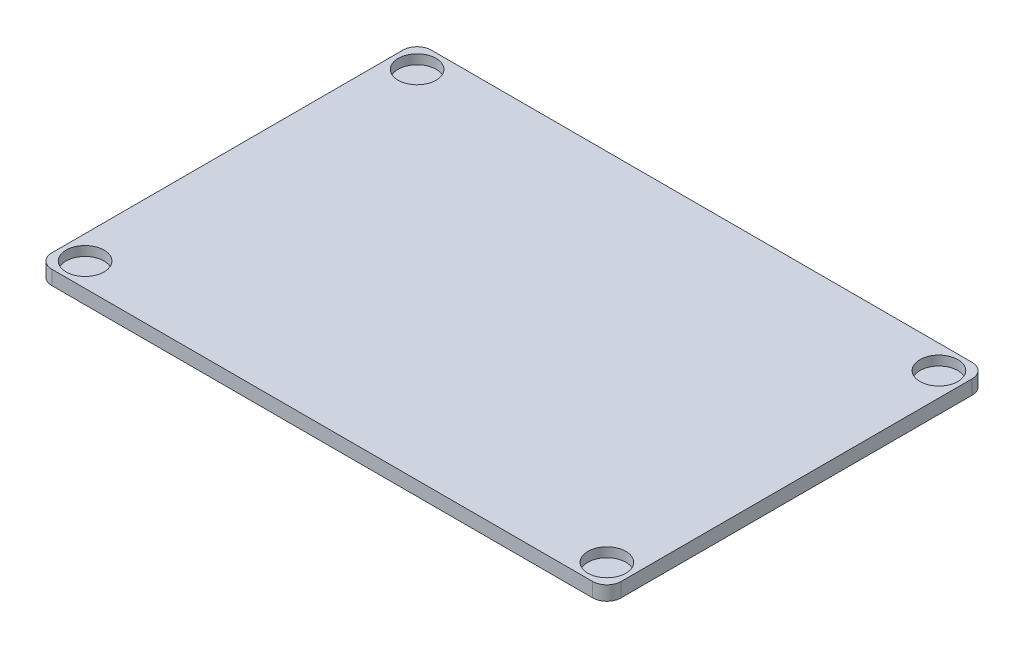
ISO-10303-21;
HEADER;
FILE_DESCRIPTION(('STEP AP214'),'2;1');
FILE_NAME('part.step','',(''),(''),'','','');
FILE_SCHEMA(('AUTOMOTIVE_DESIGN { 1 0 10303 214 1 1 1 1 }'));
ENDSEC;
DATA;
#1=APPLICATION_CONTEXT('core data for automotive mechanical design processes');
#2=APPLICATION_PROTOCOL_DEFINITION('international standard','automotive_design',2000,#1);
#3=PRODUCT_CONTEXT('',#1,'mechanical');
#4=PRODUCT('Part','Part','',(#3));
#5=PRODUCT_RELATED_PRODUCT_CATEGORY('part','',(#4));
#6=PRODUCT_DEFINITION_FORMATION('','',#4);
#7=PRODUCT_DEFINITION_CONTEXT('part definition',#1,'design');
#8=PRODUCT_DEFINITION('design','',#6,#7);
#9=PRODUCT_DEFINITION_SHAPE('','',#8);
#10=(LENGTH_UNIT() NAMED_UNIT(*) SI_UNIT(.MILLI.,.METRE.));
#11=(NAMED_UNIT(*) PLANE_ANGLE_UNIT() SI_UNIT($,.RADIAN.));
#12=(NAMED_UNIT(*) SI_UNIT($,.STERADIAN.) SOLID_ANGLE_UNIT());
#13=UNCERTAINTY_MEASURE_WITH_UNIT(LENGTH_MEASURE(1.E-05),#10,'distance_accuracy_value','');
#14=(GEOMETRIC_REPRESENTATION_CONTEXT(3) GLOBAL_UNCERTAINTY_ASSIGNED_CONTEXT((#13)) GLOBAL_UNIT_ASSIGNED_CONTEXT((#10,
#11,#12)) REPRESENTATION_CONTEXT('',''));
#15=CARTESIAN_POINT('',(0.,0.,0.));
#16=DIRECTION('',(0.,0.,1.));
#17=DIRECTION('',(1.,0.,0.));
#18=AXIS2_PLACEMENT_3D('',#15,#16,#17);
#19=CARTESIAN_POINT('',(0.,3.,0.));
#20=DIRECTION('',(1.,0.,0.));
#21=DIRECTION('',(0.,0.,-1.));
#22=AXIS2_PLACEMENT_3D('',#19,#20,#21);
#23=PLANE('',#22);
#24=DIRECTION('',(0.,0.,1.));
#25=VECTOR('',#24,1.);
#26=CARTESIAN_POINT('',(0.,0.,0.));
#27=LINE('',#26,#25);
#28=CARTESIAN_POINT('',(0.,0.,-77.));
#29=VERTEX_POINT('',#28);
#30=CARTESIAN_POINT('',(0.,0.,-3.));
#31=VERTEX_POINT('',#30);
#32=EDGE_CURVE('E132',#29,#31,#27,.T.);
#33=ORIENTED_EDGE('',*,*,#32,.T.);
#34=DIRECTION('',(0.,-1.,0.));
#35=VECTOR('',#34,1.);
#36=CARTESIAN_POINT('',(0.,3.,-3.));
#37=LINE('',#36,#35);
#38=CARTESIAN_POINT('',(0.,3.,-3.));
#39=VERTEX_POINT('',#38);
#40=EDGE_CURVE('E110',#31,#39,#37,.F.);
#41=ORIENTED_EDGE('',*,*,#40,.T.);
#42=DIRECTION('',(0.,0.,1.));
#43=VECTOR('',#42,1.);
#44=CARTESIAN_POINT('',(0.,3.,0.));
#45=LINE('',#44,#43);
#46=CARTESIAN_POINT('',(0.,3.,-77.));
#47=VERTEX_POINT('',#46);
#48=EDGE_CURVE('E142',#47,#39,#45,.T.);
#49=ORIENTED_EDGE('',*,*,#48,.F.);
#50=DIRECTION('',(0.,-1.,0.));
#51=VECTOR('',#50,1.);
#52=CARTESIAN_POINT('',(0.,3.,-77.));
#53=LINE('',#52,#51);
#54=EDGE_CURVE('E115',#47,#29,#53,.T.);
#55=ORIENTED_EDGE('',*,*,#54,.T.);
#56=EDGE_LOOP('',(#33,#41,#49,#55));
#57=FACE_BOUND('',#56,.T.);
#58=ADVANCED_FACE('F39',(#57),#23,.F.);
#59=CARTESIAN_POINT('',(0.,3.,0.));
#60=DIRECTION('',(0.,0.,-1.));
#61=DIRECTION('',(-1.,0.,0.));
#62=AXIS2_PLACEMENT_3D('',#59,#60,#61);
#63=PLANE('',#62);
#64=DIRECTION('',(1.,0.,0.));
#65=VECTOR('',#64,1.);
#66=CARTESIAN_POINT('',(0.,3.,0.));
#67=LINE('',#66,#65);
#68=CARTESIAN_POINT('',(3.,3.,0.));
#69=VERTEX_POINT('',#68);
#70=CARTESIAN_POINT('',(117.,3.,0.));
#71=VERTEX_POINT('',#70);
#72=EDGE_CURVE('E125',#69,#71,#67,.T.);
#73=ORIENTED_EDGE('',*,*,#72,.F.);
#74=DIRECTION('',(0.,-1.,0.));
#75=VECTOR('',#74,1.);
#76=CARTESIAN_POINT('',(3.,3.,0.));
#77=LINE('',#76,#75);
#78=CARTESIAN_POINT('',(3.,0.,0.));
#79=VERTEX_POINT('',#78);
#80=EDGE_CURVE('E109',#69,#79,#77,.T.);
#81=ORIENTED_EDGE('',*,*,#80,.T.);
#82=DIRECTION('',(1.,0.,0.));
#83=VECTOR('',#82,1.);
#84=CARTESIAN_POINT('',(0.,0.,0.));
#85=LINE('',#84,#83);
#86=CARTESIAN_POINT('',(117.,0.,0.));
#87=VERTEX_POINT('',#86);
#88=EDGE_CURVE('E122',#79,#87,#85,.T.);
#89=ORIENTED_EDGE('',*,*,#88,.T.);
#90=DIRECTION('',(0.,-1.,0.));
#91=VECTOR('',#90,1.);
#92=CARTESIAN_POINT('',(117.,3.,0.));
#93=LINE('',#92,#91);
#94=EDGE_CURVE('E127',#87,#71,#93,.F.);
#95=ORIENTED_EDGE('',*,*,#94,.T.);
#96=EDGE_LOOP('',(#73,#81,#89,#95));
#97=FACE_BOUND('',#96,.T.);
#98=ADVANCED_FACE('F121',(#97),#63,.F.);
#99=CARTESIAN_POINT('',(120.,3.,0.));
#100=DIRECTION('',(-1.,0.,0.));
#101=DIRECTION('',(0.,0.,1.));
#102=AXIS2_PLACEMENT_3D('',#99,#100,#101);
#103=PLANE('',#102);
#104=DIRECTION('',(0.,0.,-1.));
#105=VECTOR('',#104,1.);
#106=CARTESIAN_POINT('',(120.,0.,0.));
#107=LINE('',#106,#105);
#108=CARTESIAN_POINT('',(120.,0.,-3.));
#109=VERTEX_POINT('',#108);
#110=CARTESIAN_POINT('',(120.,0.,-77.));
#111=VERTEX_POINT('',#110);
#112=EDGE_CURVE('E131',#109,#111,#107,.T.);
#113=ORIENTED_EDGE('',*,*,#112,.T.);
#114=DIRECTION('',(0.,-1.,0.));
#115=VECTOR('',#114,1.);
#116=CARTESIAN_POINT('',(120.,3.,-77.));
#117=LINE('',#116,#115);
#118=CARTESIAN_POINT('',(120.,3.,-77.));
#119=VERTEX_POINT('',#118);
#120=EDGE_CURVE('E11',#111,#119,#117,.F.);
#121=ORIENTED_EDGE('',*,*,#120,.T.);
#122=DIRECTION('',(0.,0.,-1.));
#123=VECTOR('',#122,1.);
#124=CARTESIAN_POINT('',(120.,3.,0.));
#125=LINE('',#124,#123);
#126=CARTESIAN_POINT('',(120.,3.,-3.));
#127=VERTEX_POINT('',#126);
#128=EDGE_CURVE('E168',#127,#119,#125,.T.);
#129=ORIENTED_EDGE('',*,*,#128,.F.);
#130=DIRECTION('',(0.,-1.,0.));
#131=VECTOR('',#130,1.);
#132=CARTESIAN_POINT('',(120.,3.,-3.));
#133=LINE('',#132,#131);
#134=EDGE_CURVE('E47',#127,#109,#133,.T.);
#135=ORIENTED_EDGE('',*,*,#134,.T.);
#136=EDGE_LOOP('',(#113,#121,#129,#135));
#137=FACE_BOUND('',#136,.T.);
#138=ADVANCED_FACE('F166',(#137),#103,.F.);
#139=CARTESIAN_POINT('',(0.,3.,-80.));
#140=DIRECTION('',(0.,0.,1.));
#141=DIRECTION('',(1.,0.,0.));
#142=AXIS2_PLACEMENT_3D('',#139,#140,#141);
#143=PLANE('',#142);
#144=DIRECTION('',(-1.,0.,0.));
#145=VECTOR('',#144,1.);
#146=CARTESIAN_POINT('',(0.,0.,-80.));
#147=LINE('',#146,#145);
#148=CARTESIAN_POINT('',(117.,0.,-80.));
#149=VERTEX_POINT('',#148);
#150=CARTESIAN_POINT('',(3.,0.,-80.));
#151=VERTEX_POINT('',#150);
#152=EDGE_CURVE('E135',#149,#151,#147,.T.);
#153=ORIENTED_EDGE('',*,*,#152,.T.);
#154=DIRECTION('',(0.,-1.,0.));
#155=VECTOR('',#154,1.);
#156=CARTESIAN_POINT('',(3.,3.,-80.));
#157=LINE('',#156,#155);
#158=CARTESIAN_POINT('',(3.,3.,-80.));
#159=VERTEX_POINT('',#158);
#160=EDGE_CURVE('E54',#151,#159,#157,.F.);
#161=ORIENTED_EDGE('',*,*,#160,.T.);
#162=DIRECTION('',(-1.,0.,0.));
#163=VECTOR('',#162,1.);
#164=CARTESIAN_POINT('',(0.,3.,-80.));
#165=LINE('',#164,#163);
#166=CARTESIAN_POINT('',(117.,3.,-80.));
#167=VERTEX_POINT('',#166);
#168=EDGE_CURVE('E143',#167,#159,#165,.T.);
#169=ORIENTED_EDGE('',*,*,#168,.F.);
#170=DIRECTION('',(0.,-1.,0.));
#171=VECTOR('',#170,1.);
#172=CARTESIAN_POINT('',(117.,3.,-80.));
#173=LINE('',#172,#171);
#174=EDGE_CURVE('E159',#167,#149,#173,.T.);
#175=ORIENTED_EDGE('',*,*,#174,.T.);
#176=EDGE_LOOP('',(#153,#161,#169,#175));
#177=FACE_BOUND('',#176,.T.);
#178=ADVANCED_FACE('F175',(#177),#143,.F.);
#179=CARTESIAN_POINT('',(0.,3.,0.));
#180=DIRECTION('',(0.,-1.,0.));
#181=DIRECTION('',(0.,0.,-1.));
#182=AXIS2_PLACEMENT_3D('',#179,#180,#181);
#183=PLANE('',#182);
#184=CARTESIAN_POINT('',(115.,3.,-5.));
#185=DIRECTION('',(0.,1.,0.));
#186=DIRECTION('',(0.,0.,-1.));
#187=AXIS2_PLACEMENT_3D('',#184,#185,#186);
#188=CIRCLE('',#187,4.);
#189=CARTESIAN_POINT('',(115.,3.,-9.00000000000001));
#190=VERTEX_POINT('',#189);
#191=EDGE_CURVE('E200',#190,#190,#188,.T.);
#192=ORIENTED_EDGE('',*,*,#191,.F.);
#193=EDGE_LOOP('',(#192));
#194=FACE_BOUND('',#193,.T.);
#195=CARTESIAN_POINT('',(115.,3.,-75.));
#196=DIRECTION('',(0.,-1.,0.));
#197=DIRECTION('',(0.,0.,1.));
#198=AXIS2_PLACEMENT_3D('',#195,#196,#197);
#199=CIRCLE('',#198,4.);
#200=CARTESIAN_POINT('',(115.,3.,-71.));
#201=VERTEX_POINT('',#200);
#202=EDGE_CURVE('E194',#201,#201,#199,.T.);
#203=ORIENTED_EDGE('',*,*,#202,.T.);
#204=EDGE_LOOP('',(#203));
#205=FACE_BOUND('',#204,.T.);
#206=CARTESIAN_POINT('',(5.,3.,-5.));
#207=DIRECTION('',(0.,-1.,0.));
#208=DIRECTION('',(0.,0.,-1.));
#209=AXIS2_PLACEMENT_3D('',#206,#207,#208);
#210=CIRCLE('',#209,4.);
#211=CARTESIAN_POINT('',(5.,3.,-9.00000000000001));
#212=VERTEX_POINT('',#211);
#213=EDGE_CURVE('E188',#212,#212,#210,.T.);
#214=ORIENTED_EDGE('',*,*,#213,.T.);
#215=EDGE_LOOP('',(#214));
#216=FACE_BOUND('',#215,.T.);
#217=CARTESIAN_POINT('',(5.,3.,-75.));
#218=DIRECTION('',(0.,1.,0.));
#219=DIRECTION('',(0.,0.,1.));
#220=AXIS2_PLACEMENT_3D('',#217,#218,#219);
#221=CIRCLE('',#220,4.);
#222=CARTESIAN_POINT('',(5.,3.,-71.));
#223=VERTEX_POINT('',#222);
#224=EDGE_CURVE('E182',#223,#223,#221,.T.);
#225=ORIENTED_EDGE('',*,*,#224,.F.);
#226=EDGE_LOOP('',(#225));
#227=FACE_BOUND('',#226,.T.);
#228=ORIENTED_EDGE('',*,*,#48,.T.);
#229=CARTESIAN_POINT('',(3.,3.,-3.));
#230=DIRECTION('',(0.,-1.,0.));
#231=DIRECTION('',(0.,0.,-1.));
#232=AXIS2_PLACEMENT_3D('',#229,#230,#231);
#233=CIRCLE('',#232,3.);
#234=EDGE_CURVE('E157',#39,#69,#233,.F.);
#235=ORIENTED_EDGE('',*,*,#234,.T.);
#236=ORIENTED_EDGE('',*,*,#72,.T.);
#237=CARTESIAN_POINT('',(117.,3.,-3.));
#238=DIRECTION('',(0.,-1.,0.));
#239=DIRECTION('',(0.,0.,-1.));
#240=AXIS2_PLACEMENT_3D('',#237,#238,#239);
#241=CIRCLE('',#240,3.);
#242=EDGE_CURVE('E152',#71,#127,#241,.F.);
#243=ORIENTED_EDGE('',*,*,#242,.T.);
#244=ORIENTED_EDGE('',*,*,#128,.T.);
#245=CARTESIAN_POINT('',(117.,3.,-77.));
#246=DIRECTION('',(0.,-1.,0.));
#247=DIRECTION('',(0.,0.,-1.));
#248=AXIS2_PLACEMENT_3D('',#245,#246,#247);
#249=CIRCLE('',#248,3.);
#250=EDGE_CURVE('E61',#119,#167,#249,.F.);
#251=ORIENTED_EDGE('',*,*,#250,.T.);
#252=ORIENTED_EDGE('',*,*,#168,.T.);
#253=CARTESIAN_POINT('',(3.,3.,-77.));
#254=DIRECTION('',(0.,-1.,0.));
#255=DIRECTION('',(0.,0.,-1.));
#256=AXIS2_PLACEMENT_3D('',#253,#254,#255);
#257=CIRCLE('',#256,3.);
#258=EDGE_CURVE('E155',#159,#47,#257,.F.);
#259=ORIENTED_EDGE('',*,*,#258,.T.);
#260=EDGE_LOOP('',(#228,#235,#236,#243,#244,#251,#252,#259));
#261=FACE_BOUND('',#260,.T.);
#262=ADVANCED_FACE('F215',(#194,#205,#216,#227,#261),#183,.F.);
#263=CARTESIAN_POINT('',(0.,0.,0.));
#264=DIRECTION('',(0.,-1.,0.));
#265=DIRECTION('',(0.,0.,-1.));
#266=AXIS2_PLACEMENT_3D('',#263,#264,#265);
#267=PLANE('',#266);
#268=ORIENTED_EDGE('',*,*,#88,.F.);
#269=CARTESIAN_POINT('',(3.,0.,-3.));
#270=DIRECTION('',(0.,-1.,0.));
#271=DIRECTION('',(0.,0.,-1.));
#272=AXIS2_PLACEMENT_3D('',#269,#270,#271);
#273=CIRCLE('',#272,3.);
#274=EDGE_CURVE('E105',#79,#31,#273,.T.);
#275=ORIENTED_EDGE('',*,*,#274,.T.);
#276=ORIENTED_EDGE('',*,*,#32,.F.);
#277=CARTESIAN_POINT('',(3.,0.,-77.));
#278=DIRECTION('',(0.,-1.,0.));
#279=DIRECTION('',(0.,0.,-1.));
#280=AXIS2_PLACEMENT_3D('',#277,#278,#279);
#281=CIRCLE('',#280,3.);
#282=EDGE_CURVE('E116',#29,#151,#281,.T.);
#283=ORIENTED_EDGE('',*,*,#282,.T.);
#284=ORIENTED_EDGE('',*,*,#152,.F.);
#285=CARTESIAN_POINT('',(117.,0.,-77.));
#286=DIRECTION('',(0.,-1.,0.));
#287=DIRECTION('',(0.,0.,-1.));
#288=AXIS2_PLACEMENT_3D('',#285,#286,#287);
#289=CIRCLE('',#288,3.);
#290=EDGE_CURVE('E146',#149,#111,#289,.T.);
#291=ORIENTED_EDGE('',*,*,#290,.T.);
#292=ORIENTED_EDGE('',*,*,#112,.F.);
#293=CARTESIAN_POINT('',(117.,0.,-3.));
#294=DIRECTION('',(0.,-1.,0.));
#295=DIRECTION('',(0.,0.,-1.));
#296=AXIS2_PLACEMENT_3D('',#293,#294,#295);
#297=CIRCLE('',#296,3.);
#298=EDGE_CURVE('E126',#109,#87,#297,.T.);
#299=ORIENTED_EDGE('',*,*,#298,.T.);
#300=EDGE_LOOP('',(#268,#275,#276,#283,#284,#291,#292,#299));
#301=FACE_BOUND('',#300,.T.);
#302=ADVANCED_FACE('F129',(#301),#267,.T.);
#303=CARTESIAN_POINT('',(5.,1.,-75.));
#304=DIRECTION('',(0.,1.,0.));
#305=DIRECTION('',(0.,0.,1.));
#306=AXIS2_PLACEMENT_3D('',#303,#304,#305);
#307=CYLINDRICAL_SURFACE('',#306,4.);
#308=CARTESIAN_POINT('',(5.,1.,-75.));
#309=DIRECTION('',(0.,1.,0.));
#310=DIRECTION('',(0.,0.,1.));
#311=AXIS2_PLACEMENT_3D('',#308,#309,#310);
#312=CIRCLE('',#311,4.);
#313=CARTESIAN_POINT('',(5.,1.,-71.));
#314=VERTEX_POINT('',#313);
#315=EDGE_CURVE('E137',#314,#314,#312,.T.);
#316=ORIENTED_EDGE('',*,*,#315,.F.);
#317=EDGE_LOOP('',(#316));
#318=FACE_BOUND('',#317,.T.);
#319=ORIENTED_EDGE('',*,*,#224,.T.);
#320=EDGE_LOOP('',(#319));
#321=FACE_BOUND('',#320,.T.);
#322=ADVANCED_FACE('F249',(#318,#321),#307,.F.);
#323=CARTESIAN_POINT('',(5.,1.,-75.));
#324=DIRECTION('',(0.,1.,0.));
#325=DIRECTION('',(0.,0.,1.));
#326=AXIS2_PLACEMENT_3D('',#323,#324,#325);
#327=PLANE('',#326);
#328=ORIENTED_EDGE('',*,*,#315,.T.);
#329=EDGE_LOOP('',(#328));
#330=FACE_BOUND('',#329,.T.);
#331=ADVANCED_FACE('F253',(#330),#327,.T.);
#332=CARTESIAN_POINT('',(5.,1.,-5.));
#333=DIRECTION('',(0.,1.,0.));
#334=DIRECTION('',(0.,0.,1.));
#335=AXIS2_PLACEMENT_3D('',#332,#333,#334);
#336=CYLINDRICAL_SURFACE('',#335,4.);
#337=CARTESIAN_POINT('',(5.,1.,-5.));
#338=DIRECTION('',(0.,-1.,0.));
#339=DIRECTION('',(0.,0.,-1.));
#340=AXIS2_PLACEMENT_3D('',#337,#338,#339);
#341=CIRCLE('',#340,4.);
#342=CARTESIAN_POINT('',(5.,1.,-9.00000000000001));
#343=VERTEX_POINT('',#342);
#344=EDGE_CURVE('E185',#343,#343,#341,.T.);
#345=ORIENTED_EDGE('',*,*,#344,.T.);
#346=EDGE_LOOP('',(#345));
#347=FACE_BOUND('',#346,.T.);
#348=ORIENTED_EDGE('',*,*,#213,.F.);
#349=EDGE_LOOP('',(#348));
#350=FACE_BOUND('',#349,.T.);
#351=ADVANCED_FACE('F257',(#347,#350),#336,.F.);
#352=CARTESIAN_POINT('',(5.,1.,-5.));
#353=DIRECTION('',(0.,1.,0.));
#354=DIRECTION('',(0.,0.,-1.));
#355=AXIS2_PLACEMENT_3D('',#352,#353,#354);
#356=PLANE('',#355);
#357=ORIENTED_EDGE('',*,*,#344,.F.);
#358=EDGE_LOOP('',(#357));
#359=FACE_BOUND('',#358,.T.);
#360=ADVANCED_FACE('F261',(#359),#356,.T.);
#361=CARTESIAN_POINT('',(115.,1.,-75.));
#362=DIRECTION('',(0.,1.,0.));
#363=DIRECTION('',(0.,0.,1.));
#364=AXIS2_PLACEMENT_3D('',#361,#362,#363);
#365=CYLINDRICAL_SURFACE('',#364,4.);
#366=CARTESIAN_POINT('',(115.,1.,-75.));
#367=DIRECTION('',(0.,-1.,0.));
#368=DIRECTION('',(0.,0.,1.));
#369=AXIS2_PLACEMENT_3D('',#366,#367,#368);
#370=CIRCLE('',#369,4.);
#371=CARTESIAN_POINT('',(115.,1.,-71.));
#372=VERTEX_POINT('',#371);
#373=EDGE_CURVE('E191',#372,#372,#370,.T.);
#374=ORIENTED_EDGE('',*,*,#373,.T.);
#375=EDGE_LOOP('',(#374));
#376=FACE_BOUND('',#375,.T.);
#377=ORIENTED_EDGE('',*,*,#202,.F.);
#378=EDGE_LOOP('',(#377));
#379=FACE_BOUND('',#378,.T.);
#380=ADVANCED_FACE('F265',(#376,#379),#365,.F.);
#381=CARTESIAN_POINT('',(115.,1.,-75.));
#382=DIRECTION('',(0.,1.,0.));
#383=DIRECTION('',(0.,0.,1.));
#384=AXIS2_PLACEMENT_3D('',#381,#382,#383);
#385=PLANE('',#384);
#386=ORIENTED_EDGE('',*,*,#373,.F.);
#387=EDGE_LOOP('',(#386));
#388=FACE_BOUND('',#387,.T.);
#389=ADVANCED_FACE('F211',(#388),#385,.T.);
#390=CARTESIAN_POINT('',(115.,1.,-5.));
#391=DIRECTION('',(0.,1.,0.));
#392=DIRECTION('',(0.,0.,1.));
#393=AXIS2_PLACEMENT_3D('',#390,#391,#392);
#394=CYLINDRICAL_SURFACE('',#393,4.);
#395=CARTESIAN_POINT('',(115.,1.,-5.));
#396=DIRECTION('',(0.,1.,0.));
#397=DIRECTION('',(0.,0.,-1.));
#398=AXIS2_PLACEMENT_3D('',#395,#396,#397);
#399=CIRCLE('',#398,4.);
#400=CARTESIAN_POINT('',(115.,1.,-9.00000000000001));
#401=VERTEX_POINT('',#400);
#402=EDGE_CURVE('E197',#401,#401,#399,.T.);
#403=ORIENTED_EDGE('',*,*,#402,.F.);
#404=EDGE_LOOP('',(#403));
#405=FACE_BOUND('',#404,.T.);
#406=ORIENTED_EDGE('',*,*,#191,.T.);
#407=EDGE_LOOP('',(#406));
#408=FACE_BOUND('',#407,.T.);
#409=ADVANCED_FACE('F208',(#405,#408),#394,.F.);
#410=CARTESIAN_POINT('',(115.,1.,-5.));
#411=DIRECTION('',(0.,1.,0.));
#412=DIRECTION('',(0.,0.,-1.));
#413=AXIS2_PLACEMENT_3D('',#410,#411,#412);
#414=PLANE('',#413);
#415=ORIENTED_EDGE('',*,*,#402,.T.);
#416=EDGE_LOOP('',(#415));
#417=FACE_BOUND('',#416,.T.);
#418=ADVANCED_FACE('F206',(#417),#414,.T.);
#419=CARTESIAN_POINT('',(3.,3.,-3.));
#420=DIRECTION('',(0.,-1.,0.));
#421=DIRECTION('',(0.,0.,-1.));
#422=AXIS2_PLACEMENT_3D('',#419,#420,#421);
#423=CYLINDRICAL_SURFACE('',#422,3.);
#424=ORIENTED_EDGE('',*,*,#234,.F.);
#425=ORIENTED_EDGE('',*,*,#40,.F.);
#426=ORIENTED_EDGE('',*,*,#274,.F.);
#427=ORIENTED_EDGE('',*,*,#80,.F.);
#428=EDGE_LOOP('',(#424,#425,#426,#427));
#429=FACE_BOUND('',#428,.T.);
#430=ADVANCED_FACE('F108',(#429),#423,.T.);
#431=CARTESIAN_POINT('',(3.,3.,-77.));
#432=DIRECTION('',(0.,-1.,0.));
#433=DIRECTION('',(0.,0.,-1.));
#434=AXIS2_PLACEMENT_3D('',#431,#432,#433);
#435=CYLINDRICAL_SURFACE('',#434,3.);
#436=ORIENTED_EDGE('',*,*,#258,.F.);
#437=ORIENTED_EDGE('',*,*,#160,.F.);
#438=ORIENTED_EDGE('',*,*,#282,.F.);
#439=ORIENTED_EDGE('',*,*,#54,.F.);
#440=EDGE_LOOP('',(#436,#437,#438,#439));
#441=FACE_BOUND('',#440,.T.);
#442=ADVANCED_FACE('F228',(#441),#435,.T.);
#443=CARTESIAN_POINT('',(117.,3.,-77.));
#444=DIRECTION('',(0.,-1.,0.));
#445=DIRECTION('',(0.,0.,-1.));
#446=AXIS2_PLACEMENT_3D('',#443,#444,#445);
#447=CYLINDRICAL_SURFACE('',#446,3.);
#448=ORIENTED_EDGE('',*,*,#250,.F.);
#449=ORIENTED_EDGE('',*,*,#120,.F.);
#450=ORIENTED_EDGE('',*,*,#290,.F.);
#451=ORIENTED_EDGE('',*,*,#174,.F.);
#452=EDGE_LOOP('',(#448,#449,#450,#451));
#453=FACE_BOUND('',#452,.T.);
#454=ADVANCED_FACE('F174',(#453),#447,.T.);
#455=CARTESIAN_POINT('',(117.,3.,-3.));
#456=DIRECTION('',(0.,-1.,0.));
#457=DIRECTION('',(0.,0.,-1.));
#458=AXIS2_PLACEMENT_3D('',#455,#456,#457);
#459=CYLINDRICAL_SURFACE('',#458,3.);
#460=ORIENTED_EDGE('',*,*,#242,.F.);
#461=ORIENTED_EDGE('',*,*,#94,.F.);
#462=ORIENTED_EDGE('',*,*,#298,.F.);
#463=ORIENTED_EDGE('',*,*,#134,.F.);
#464=EDGE_LOOP('',(#460,#461,#462,#463));
#465=FACE_BOUND('',#464,.T.);
#466=ADVANCED_FACE('F41',(#465),#459,.T.);
#467=CLOSED_SHELL('',(#58,#98,#138,#178,#262,#302,#322,#331,#351,#360,#380,#389,#409,#418,#430,
#442,#454,#466));
#468=MANIFOLD_SOLID_BREP('B2',#467);
#469=ADVANCED_BREP_SHAPE_REPRESENTATION('',(#18,#468),#14);
#470=SHAPE_DEFINITION_REPRESENTATION(#9,#469);
ENDSEC;
END-ISO-10303-21;
